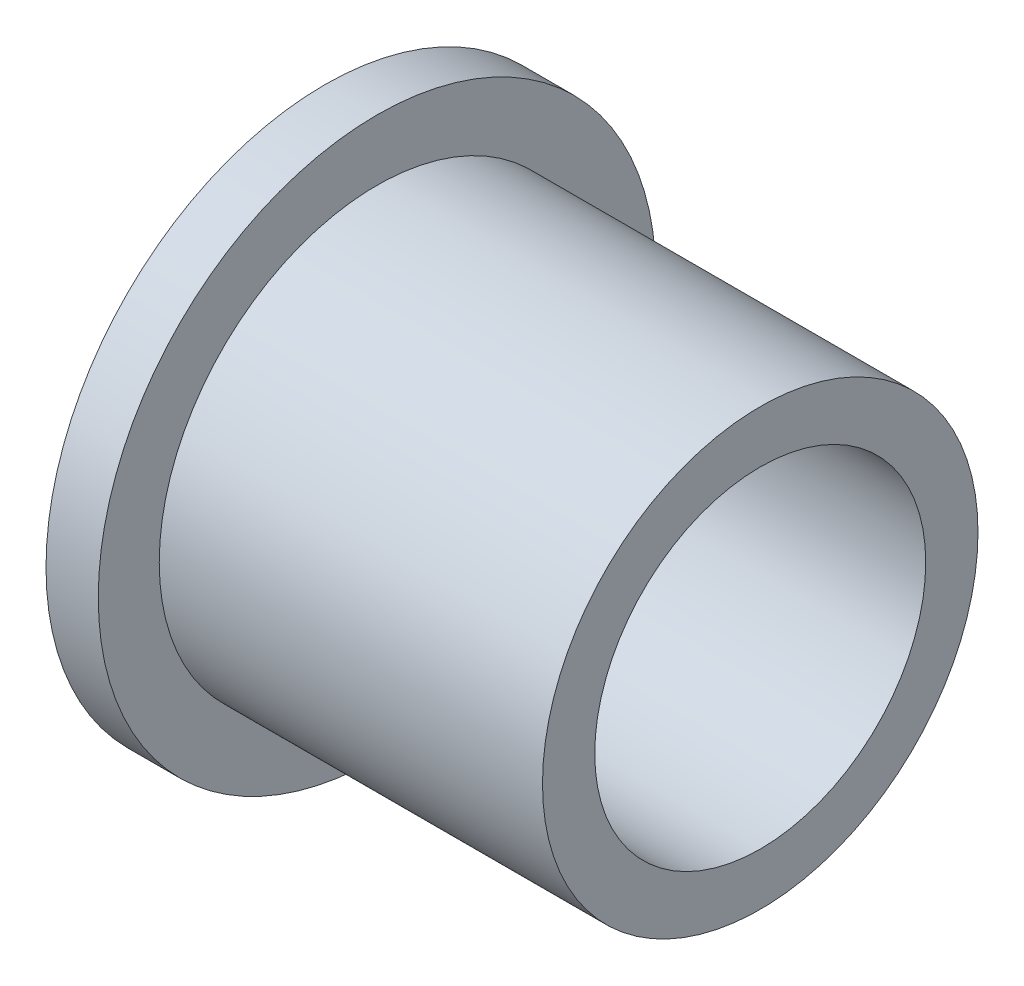
ISO-10303-21;
HEADER;
FILE_DESCRIPTION(('STEP AP214'),'2;1');
FILE_NAME('part.step','',(''),(''),'','','');
FILE_SCHEMA(('AUTOMOTIVE_DESIGN { 1 0 10303 214 1 1 1 1 }'));
ENDSEC;
DATA;
#1=APPLICATION_CONTEXT('core data for automotive mechanical design processes');
#2=APPLICATION_PROTOCOL_DEFINITION('international standard','automotive_design',2000,#1);
#3=PRODUCT_CONTEXT('',#1,'mechanical');
#4=PRODUCT('Part','Part','',(#3));
#5=PRODUCT_RELATED_PRODUCT_CATEGORY('part','',(#4));
#6=PRODUCT_DEFINITION_FORMATION('','',#4);
#7=PRODUCT_DEFINITION_CONTEXT('part definition',#1,'design');
#8=PRODUCT_DEFINITION('design','',#6,#7);
#9=PRODUCT_DEFINITION_SHAPE('','',#8);
#10=(LENGTH_UNIT() NAMED_UNIT(*) SI_UNIT(.MILLI.,.METRE.));
#11=(NAMED_UNIT(*) PLANE_ANGLE_UNIT() SI_UNIT($,.RADIAN.));
#12=(NAMED_UNIT(*) SI_UNIT($,.STERADIAN.) SOLID_ANGLE_UNIT());
#13=UNCERTAINTY_MEASURE_WITH_UNIT(LENGTH_MEASURE(1.E-05),#10,'distance_accuracy_value','');
#14=(GEOMETRIC_REPRESENTATION_CONTEXT(3) GLOBAL_UNCERTAINTY_ASSIGNED_CONTEXT((#13)) GLOBAL_UNIT_ASSIGNED_CONTEXT((#10,
#11,#12)) REPRESENTATION_CONTEXT('',''));
#15=CARTESIAN_POINT('',(0.,0.,0.));
#16=DIRECTION('',(0.,0.,1.));
#17=DIRECTION('',(1.,0.,0.));
#18=AXIS2_PLACEMENT_3D('',#15,#16,#17);
#19=CARTESIAN_POINT('',(-38.1904761904762,0.,0.));
#20=DIRECTION('',(-1.,0.,0.));
#21=DIRECTION('',(0.,0.,1.));
#22=AXIS2_PLACEMENT_3D('',#19,#20,#21);
#23=CYLINDRICAL_SURFACE('',#22,16.);
#24=CARTESIAN_POINT('',(0.,0.,0.));
#25=DIRECTION('',(-1.,0.,0.));
#26=DIRECTION('',(0.,0.,1.));
#27=AXIS2_PLACEMENT_3D('',#24,#25,#26);
#28=CIRCLE('',#27,16.);
#29=CARTESIAN_POINT('',(0.,0.,16.));
#30=VERTEX_POINT('',#29);
#31=EDGE_CURVE('E51',#30,#30,#28,.T.);
#32=ORIENTED_EDGE('',*,*,#31,.F.);
#33=EDGE_LOOP('',(#32));
#34=FACE_BOUND('',#33,.T.);
#35=CARTESIAN_POINT('',(3.,0.,0.));
#36=DIRECTION('',(-1.,0.,0.));
#37=DIRECTION('',(0.,0.,1.));
#38=AXIS2_PLACEMENT_3D('',#35,#36,#37);
#39=CIRCLE('',#38,16.);
#40=CARTESIAN_POINT('',(3.,0.,16.));
#41=VERTEX_POINT('',#40);
#42=EDGE_CURVE('E10',#41,#41,#39,.T.);
#43=ORIENTED_EDGE('',*,*,#42,.T.);
#44=EDGE_LOOP('',(#43));
#45=FACE_BOUND('',#44,.T.);
#46=ADVANCED_FACE('F37',(#34,#45),#23,.T.);
#47=CARTESIAN_POINT('',(3.00000000000001,16.,0.));
#48=DIRECTION('',(-1.,0.,0.));
#49=DIRECTION('',(0.,0.,1.));
#50=AXIS2_PLACEMENT_3D('',#47,#48,#49);
#51=PLANE('',#50);
#52=ORIENTED_EDGE('',*,*,#42,.F.);
#53=EDGE_LOOP('',(#52));
#54=FACE_BOUND('',#53,.T.);
#55=CARTESIAN_POINT('',(3.,0.,0.));
#56=DIRECTION('',(-1.,0.,0.));
#57=DIRECTION('',(0.,0.,1.));
#58=AXIS2_PLACEMENT_3D('',#55,#56,#57);
#59=CIRCLE('',#58,12.5);
#60=CARTESIAN_POINT('',(3.,0.,12.5));
#61=VERTEX_POINT('',#60);
#62=EDGE_CURVE('E43',#61,#61,#59,.T.);
#63=ORIENTED_EDGE('',*,*,#62,.T.);
#64=EDGE_LOOP('',(#63));
#65=FACE_BOUND('',#64,.T.);
#66=ADVANCED_FACE('F80',(#54,#65),#51,.F.);
#67=CARTESIAN_POINT('',(-38.1904761904762,0.,0.));
#68=DIRECTION('',(-1.,0.,0.));
#69=DIRECTION('',(0.,0.,1.));
#70=AXIS2_PLACEMENT_3D('',#67,#68,#69);
#71=CYLINDRICAL_SURFACE('',#70,12.5);
#72=ORIENTED_EDGE('',*,*,#62,.F.);
#73=EDGE_LOOP('',(#72));
#74=FACE_BOUND('',#73,.T.);
#75=CARTESIAN_POINT('',(25.,0.,0.));
#76=DIRECTION('',(-1.,0.,0.));
#77=DIRECTION('',(0.,0.,1.));
#78=AXIS2_PLACEMENT_3D('',#75,#76,#77);
#79=CIRCLE('',#78,12.5);
#80=CARTESIAN_POINT('',(25.,0.,12.5));
#81=VERTEX_POINT('',#80);
#82=EDGE_CURVE('E47',#81,#81,#79,.T.);
#83=ORIENTED_EDGE('',*,*,#82,.T.);
#84=EDGE_LOOP('',(#83));
#85=FACE_BOUND('',#84,.T.);
#86=ADVANCED_FACE('F75',(#74,#85),#71,.T.);
#87=CARTESIAN_POINT('',(25.,12.5,0.));
#88=DIRECTION('',(-1.,0.,0.));
#89=DIRECTION('',(0.,0.,1.));
#90=AXIS2_PLACEMENT_3D('',#87,#88,#89);
#91=PLANE('',#90);
#92=CARTESIAN_POINT('',(25.,0.,0.));
#93=DIRECTION('',(1.,0.,0.));
#94=DIRECTION('',(0.,0.,-1.));
#95=AXIS2_PLACEMENT_3D('',#92,#93,#94);
#96=CIRCLE('',#95,9.5);
#97=CARTESIAN_POINT('',(25.,0.,-9.5));
#98=VERTEX_POINT('',#97);
#99=EDGE_CURVE('E57',#98,#98,#96,.T.);
#100=ORIENTED_EDGE('',*,*,#99,.F.);
#101=EDGE_LOOP('',(#100));
#102=FACE_BOUND('',#101,.T.);
#103=ORIENTED_EDGE('',*,*,#82,.F.);
#104=EDGE_LOOP('',(#103));
#105=FACE_BOUND('',#104,.T.);
#106=ADVANCED_FACE('F72',(#102,#105),#91,.F.);
#107=CARTESIAN_POINT('',(0.,0.,0.));
#108=DIRECTION('',(1.,0.,0.));
#109=DIRECTION('',(0.,0.,-1.));
#110=AXIS2_PLACEMENT_3D('',#107,#108,#109);
#111=PLANE('',#110);
#112=CARTESIAN_POINT('',(0.,0.,0.));
#113=DIRECTION('',(1.,0.,0.));
#114=DIRECTION('',(0.,0.,-1.));
#115=AXIS2_PLACEMENT_3D('',#112,#113,#114);
#116=CIRCLE('',#115,9.5);
#117=CARTESIAN_POINT('',(0.,0.,-9.5));
#118=VERTEX_POINT('',#117);
#119=EDGE_CURVE('E56',#118,#118,#116,.T.);
#120=ORIENTED_EDGE('',*,*,#119,.T.);
#121=EDGE_LOOP('',(#120));
#122=FACE_BOUND('',#121,.T.);
#123=ORIENTED_EDGE('',*,*,#31,.T.);
#124=EDGE_LOOP('',(#123));
#125=FACE_BOUND('',#124,.T.);
#126=ADVANCED_FACE('F63',(#122,#125),#111,.F.);
#127=CARTESIAN_POINT('',(0.,0.,0.));
#128=DIRECTION('',(1.,0.,0.));
#129=DIRECTION('',(0.,0.,-1.));
#130=AXIS2_PLACEMENT_3D('',#127,#128,#129);
#131=CYLINDRICAL_SURFACE('',#130,9.5);
#132=ORIENTED_EDGE('',*,*,#119,.F.);
#133=EDGE_LOOP('',(#132));
#134=FACE_BOUND('',#133,.T.);
#135=ORIENTED_EDGE('',*,*,#99,.T.);
#136=EDGE_LOOP('',(#135));
#137=FACE_BOUND('',#136,.T.);
#138=ADVANCED_FACE('F66',(#134,#137),#131,.F.);
#139=CLOSED_SHELL('',(#46,#66,#86,#106,#126,#138));
#140=MANIFOLD_SOLID_BREP('B2',#139);
#141=ADVANCED_BREP_SHAPE_REPRESENTATION('',(#18,#140),#14);
#142=SHAPE_DEFINITION_REPRESENTATION(#9,#141);
ENDSEC;
END-ISO-10303-21;
